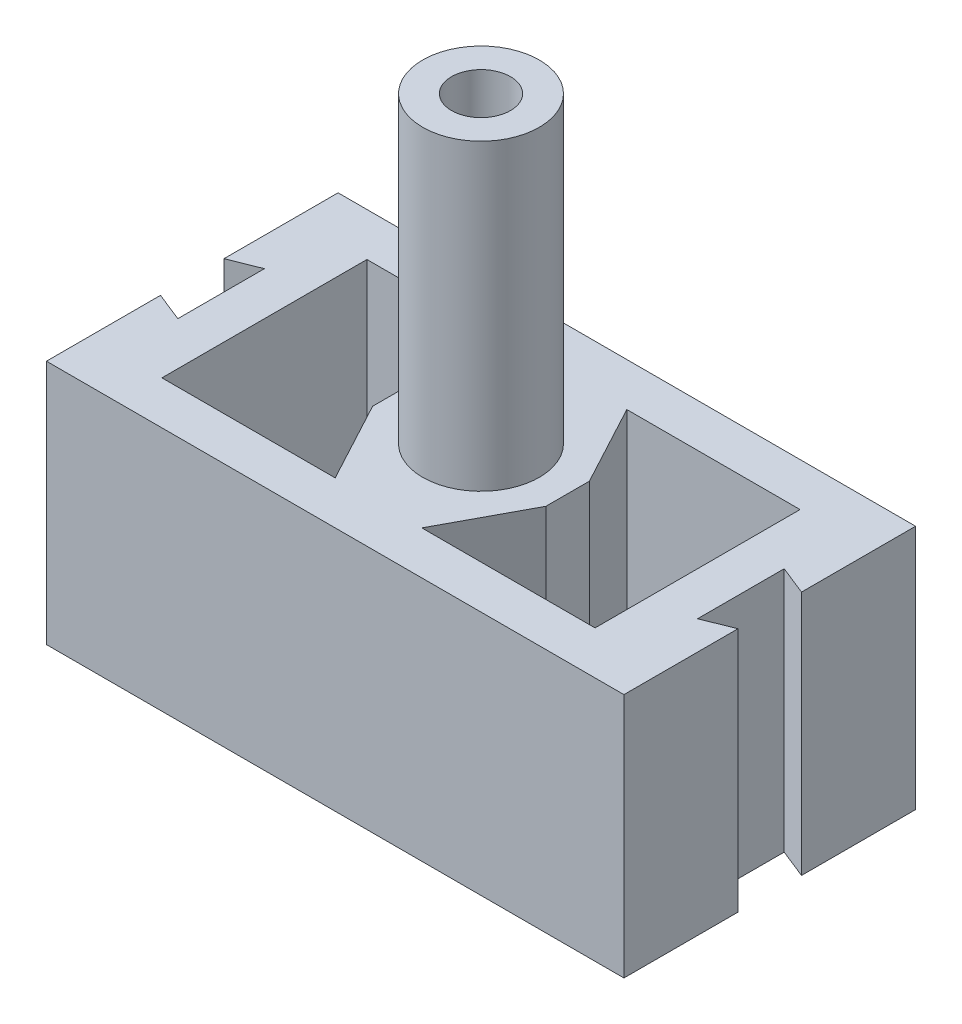
ISO-10303-21;
HEADER;
FILE_DESCRIPTION(('STEP AP214'),'2;1');
FILE_NAME('part.step','',(''),(''),'','','');
FILE_SCHEMA(('AUTOMOTIVE_DESIGN { 1 0 10303 214 1 1 1 1 }'));
ENDSEC;
DATA;
#1=APPLICATION_CONTEXT('core data for automotive mechanical design processes');
#2=APPLICATION_PROTOCOL_DEFINITION('international standard','automotive_design',2000,#1);
#3=PRODUCT_CONTEXT('',#1,'mechanical');
#4=PRODUCT('Part','Part','',(#3));
#5=PRODUCT_RELATED_PRODUCT_CATEGORY('part','',(#4));
#6=PRODUCT_DEFINITION_FORMATION('','',#4);
#7=PRODUCT_DEFINITION_CONTEXT('part definition',#1,'design');
#8=PRODUCT_DEFINITION('design','',#6,#7);
#9=PRODUCT_DEFINITION_SHAPE('','',#8);
#10=(LENGTH_UNIT() NAMED_UNIT(*) SI_UNIT(.MILLI.,.METRE.));
#11=(NAMED_UNIT(*) PLANE_ANGLE_UNIT() SI_UNIT($,.RADIAN.));
#12=(NAMED_UNIT(*) SI_UNIT($,.STERADIAN.) SOLID_ANGLE_UNIT());
#13=UNCERTAINTY_MEASURE_WITH_UNIT(LENGTH_MEASURE(1.E-05),#10,'distance_accuracy_value','');
#14=(GEOMETRIC_REPRESENTATION_CONTEXT(3) GLOBAL_UNCERTAINTY_ASSIGNED_CONTEXT((#13)) GLOBAL_UNIT_ASSIGNED_CONTEXT((#10,
#11,#12)) REPRESENTATION_CONTEXT('',''));
#15=CARTESIAN_POINT('',(0.,0.,0.));
#16=DIRECTION('',(0.,0.,1.));
#17=DIRECTION('',(1.,0.,0.));
#18=AXIS2_PLACEMENT_3D('',#15,#16,#17);
#19=CARTESIAN_POINT('',(0.,42.5,0.));
#20=DIRECTION('',(0.,1.,0.));
#21=DIRECTION('',(0.,0.,1.));
#22=AXIS2_PLACEMENT_3D('',#19,#20,#21);
#23=PLANE('',#22);
#24=CARTESIAN_POINT('',(0.,42.5,0.));
#25=DIRECTION('',(0.,1.,0.));
#26=DIRECTION('',(0.,0.,1.));
#27=AXIS2_PLACEMENT_3D('',#24,#25,#26);
#28=CIRCLE('',#27,3.1);
#29=CARTESIAN_POINT('',(0.,42.5,3.1));
#30=VERTEX_POINT('',#29);
#31=EDGE_CURVE('E299',#30,#30,#28,.T.);
#32=ORIENTED_EDGE('',*,*,#31,.F.);
#33=EDGE_LOOP('',(#32));
#34=FACE_BOUND('',#33,.T.);
#35=CARTESIAN_POINT('',(0.,42.5,0.));
#36=DIRECTION('',(0.,1.,0.));
#37=DIRECTION('',(0.,0.,1.));
#38=AXIS2_PLACEMENT_3D('',#35,#36,#37);
#39=CIRCLE('',#38,5.1);
#40=CARTESIAN_POINT('',(0.,42.5,5.1));
#41=VERTEX_POINT('',#40);
#42=EDGE_CURVE('E11',#41,#41,#39,.F.);
#43=ORIENTED_EDGE('',*,*,#42,.F.);
#44=EDGE_LOOP('',(#43));
#45=FACE_BOUND('',#44,.T.);
#46=ADVANCED_FACE('F40',(#34,#45),#23,.T.);
#47=CARTESIAN_POINT('',(8.79310344827583,42.5,21.9827586206896));
#48=DIRECTION('',(-0.371390676354103,0.,-0.92847669088526));
#49=DIRECTION('',(-0.92847669088526,0.,0.371390676354103));
#50=AXIS2_PLACEMENT_3D('',#47,#48,#49);
#51=PLANE('',#50);
#52=DIRECTION('',(0.92847669088526,0.,-0.371390676354103));
#53=VECTOR('',#52,1.);
#54=CARTESIAN_POINT('',(8.79310344827583,0.,21.9827586206896));
#55=LINE('',#54,#53);
#56=CARTESIAN_POINT('',(45.,0.,7.5));
#57=VERTEX_POINT('',#56);
#58=CARTESIAN_POINT('',(50.,0.,5.49999999999999));
#59=VERTEX_POINT('',#58);
#60=EDGE_CURVE('E335',#57,#59,#55,.T.);
#61=ORIENTED_EDGE('',*,*,#60,.F.);
#62=DIRECTION('',(0.,-1.,0.));
#63=VECTOR('',#62,1.);
#64=CARTESIAN_POINT('',(45.,42.5,7.5));
#65=LINE('',#64,#63);
#66=CARTESIAN_POINT('',(45.,42.5,7.5));
#67=VERTEX_POINT('',#66);
#68=EDGE_CURVE('E48',#67,#57,#65,.T.);
#69=ORIENTED_EDGE('',*,*,#68,.F.);
#70=DIRECTION('',(0.92847669088526,0.,-0.371390676354103));
#71=VECTOR('',#70,1.);
#72=CARTESIAN_POINT('',(8.79310344827583,42.5,21.9827586206896));
#73=LINE('',#72,#71);
#74=CARTESIAN_POINT('',(50.,42.5,5.49999999999999));
#75=VERTEX_POINT('',#74);
#76=EDGE_CURVE('E302',#67,#75,#73,.T.);
#77=ORIENTED_EDGE('',*,*,#76,.T.);
#78=DIRECTION('',(0.,-1.,0.));
#79=VECTOR('',#78,1.);
#80=CARTESIAN_POINT('',(50.,42.5,5.49999999999999));
#81=LINE('',#80,#79);
#82=EDGE_CURVE('E366',#75,#59,#81,.T.);
#83=ORIENTED_EDGE('',*,*,#82,.T.);
#84=EDGE_LOOP('',(#61,#69,#77,#83));
#85=FACE_BOUND('',#84,.T.);
#86=ADVANCED_FACE('F397',(#85),#51,.T.);
#87=CARTESIAN_POINT('',(45.,42.5,0.));
#88=DIRECTION('',(1.,0.,0.));
#89=DIRECTION('',(0.,0.,-1.));
#90=AXIS2_PLACEMENT_3D('',#87,#88,#89);
#91=PLANE('',#90);
#92=DIRECTION('',(0.,0.,1.));
#93=VECTOR('',#92,1.);
#94=CARTESIAN_POINT('',(45.,0.,0.));
#95=LINE('',#94,#93);
#96=CARTESIAN_POINT('',(45.,0.,-7.49999999999999));
#97=VERTEX_POINT('',#96);
#98=EDGE_CURVE('E338',#97,#57,#95,.T.);
#99=ORIENTED_EDGE('',*,*,#98,.F.);
#100=DIRECTION('',(0.,-1.,0.));
#101=VECTOR('',#100,1.);
#102=CARTESIAN_POINT('',(45.,42.5,-7.49999999999999));
#103=LINE('',#102,#101);
#104=CARTESIAN_POINT('',(45.,42.5,-7.49999999999999));
#105=VERTEX_POINT('',#104);
#106=EDGE_CURVE('E389',#105,#97,#103,.T.);
#107=ORIENTED_EDGE('',*,*,#106,.F.);
#108=DIRECTION('',(0.,0.,1.));
#109=VECTOR('',#108,1.);
#110=CARTESIAN_POINT('',(45.,42.5,0.));
#111=LINE('',#110,#109);
#112=EDGE_CURVE('E306',#105,#67,#111,.T.);
#113=ORIENTED_EDGE('',*,*,#112,.T.);
#114=ORIENTED_EDGE('',*,*,#68,.T.);
#115=EDGE_LOOP('',(#99,#107,#113,#114));
#116=FACE_BOUND('',#115,.T.);
#117=ADVANCED_FACE('F393',(#116),#91,.T.);
#118=CARTESIAN_POINT('',(8.79310344827585,42.5,-21.9827586206896));
#119=DIRECTION('',(-0.371390676354103,0.,0.928476690885259));
#120=DIRECTION('',(0.92847669088526,0.,0.371390676354103));
#121=AXIS2_PLACEMENT_3D('',#118,#119,#120);
#122=PLANE('',#121);
#123=DIRECTION('',(-0.92847669088526,0.,-0.371390676354103));
#124=VECTOR('',#123,1.);
#125=CARTESIAN_POINT('',(8.79310344827585,0.,-21.9827586206896));
#126=LINE('',#125,#124);
#127=CARTESIAN_POINT('',(50.,0.,-5.49999999999998));
#128=VERTEX_POINT('',#127);
#129=EDGE_CURVE('E341',#128,#97,#126,.T.);
#130=ORIENTED_EDGE('',*,*,#129,.F.);
#131=DIRECTION('',(0.,-1.,0.));
#132=VECTOR('',#131,1.);
#133=CARTESIAN_POINT('',(50.,42.5,-5.49999999999998));
#134=LINE('',#133,#132);
#135=CARTESIAN_POINT('',(50.,42.5,-5.49999999999998));
#136=VERTEX_POINT('',#135);
#137=EDGE_CURVE('E387',#136,#128,#134,.T.);
#138=ORIENTED_EDGE('',*,*,#137,.F.);
#139=DIRECTION('',(-0.92847669088526,0.,-0.371390676354103));
#140=VECTOR('',#139,1.);
#141=CARTESIAN_POINT('',(8.79310344827585,42.5,-21.9827586206896));
#142=LINE('',#141,#140);
#143=EDGE_CURVE('E309',#136,#105,#142,.T.);
#144=ORIENTED_EDGE('',*,*,#143,.T.);
#145=ORIENTED_EDGE('',*,*,#106,.T.);
#146=EDGE_LOOP('',(#130,#138,#144,#145));
#147=FACE_BOUND('',#146,.T.);
#148=ADVANCED_FACE('F405',(#147),#122,.T.);
#149=CARTESIAN_POINT('',(50.,42.5,0.));
#150=DIRECTION('',(-1.,0.,0.));
#151=DIRECTION('',(0.,0.,1.));
#152=AXIS2_PLACEMENT_3D('',#149,#150,#151);
#153=PLANE('',#152);
#154=DIRECTION('',(0.,0.,-1.));
#155=VECTOR('',#154,1.);
#156=CARTESIAN_POINT('',(50.,0.,0.));
#157=LINE('',#156,#155);
#158=CARTESIAN_POINT('',(50.,0.,-25.25));
#159=VERTEX_POINT('',#158);
#160=EDGE_CURVE('E344',#128,#159,#157,.T.);
#161=ORIENTED_EDGE('',*,*,#160,.T.);
#162=DIRECTION('',(0.,-1.,0.));
#163=VECTOR('',#162,1.);
#164=CARTESIAN_POINT('',(50.,42.5,-25.25));
#165=LINE('',#164,#163);
#166=CARTESIAN_POINT('',(50.,42.5,-25.25));
#167=VERTEX_POINT('',#166);
#168=EDGE_CURVE('E385',#167,#159,#165,.T.);
#169=ORIENTED_EDGE('',*,*,#168,.F.);
#170=DIRECTION('',(0.,0.,-1.));
#171=VECTOR('',#170,1.);
#172=CARTESIAN_POINT('',(50.,42.5,0.));
#173=LINE('',#172,#171);
#174=EDGE_CURVE('E312',#136,#167,#173,.T.);
#175=ORIENTED_EDGE('',*,*,#174,.F.);
#176=ORIENTED_EDGE('',*,*,#137,.T.);
#177=EDGE_LOOP('',(#161,#169,#175,#176));
#178=FACE_BOUND('',#177,.T.);
#179=ADVANCED_FACE('F442',(#178),#153,.F.);
#180=CARTESIAN_POINT('',(0.,42.5,-25.25));
#181=DIRECTION('',(0.,0.,-1.));
#182=DIRECTION('',(-1.,0.,0.));
#183=AXIS2_PLACEMENT_3D('',#180,#181,#182);
#184=PLANE('',#183);
#185=DIRECTION('',(1.,0.,0.));
#186=VECTOR('',#185,1.);
#187=CARTESIAN_POINT('',(0.,0.,-25.25));
#188=LINE('',#187,#186);
#189=CARTESIAN_POINT('',(-50.,0.,-25.25));
#190=VERTEX_POINT('',#189);
#191=EDGE_CURVE('E347',#190,#159,#188,.T.);
#192=ORIENTED_EDGE('',*,*,#191,.F.);
#193=DIRECTION('',(0.,-1.,0.));
#194=VECTOR('',#193,1.);
#195=CARTESIAN_POINT('',(-50.,42.5,-25.25));
#196=LINE('',#195,#194);
#197=CARTESIAN_POINT('',(-50.,42.5,-25.25));
#198=VERTEX_POINT('',#197);
#199=EDGE_CURVE('E383',#198,#190,#196,.T.);
#200=ORIENTED_EDGE('',*,*,#199,.F.);
#201=DIRECTION('',(1.,0.,0.));
#202=VECTOR('',#201,1.);
#203=CARTESIAN_POINT('',(0.,42.5,-25.25));
#204=LINE('',#203,#202);
#205=EDGE_CURVE('E314',#198,#167,#204,.T.);
#206=ORIENTED_EDGE('',*,*,#205,.T.);
#207=ORIENTED_EDGE('',*,*,#168,.T.);
#208=EDGE_LOOP('',(#192,#200,#206,#207));
#209=FACE_BOUND('',#208,.T.);
#210=ADVANCED_FACE('F438',(#209),#184,.T.);
#211=CARTESIAN_POINT('',(-50.,42.5,0.));
#212=DIRECTION('',(-1.,0.,0.));
#213=DIRECTION('',(0.,0.,1.));
#214=AXIS2_PLACEMENT_3D('',#211,#212,#213);
#215=PLANE('',#214);
#216=DIRECTION('',(0.,0.,-1.));
#217=VECTOR('',#216,1.);
#218=CARTESIAN_POINT('',(-50.,0.,0.));
#219=LINE('',#218,#217);
#220=CARTESIAN_POINT('',(-50.,0.,-5.49999999999999));
#221=VERTEX_POINT('',#220);
#222=EDGE_CURVE('E350',#221,#190,#219,.T.);
#223=ORIENTED_EDGE('',*,*,#222,.F.);
#224=DIRECTION('',(0.,-1.,0.));
#225=VECTOR('',#224,1.);
#226=CARTESIAN_POINT('',(-50.,42.5,-5.49999999999999));
#227=LINE('',#226,#225);
#228=CARTESIAN_POINT('',(-50.,42.5,-5.49999999999999));
#229=VERTEX_POINT('',#228);
#230=EDGE_CURVE('E381',#229,#221,#227,.T.);
#231=ORIENTED_EDGE('',*,*,#230,.F.);
#232=DIRECTION('',(0.,0.,-1.));
#233=VECTOR('',#232,1.);
#234=CARTESIAN_POINT('',(-50.,42.5,0.));
#235=LINE('',#234,#233);
#236=EDGE_CURVE('E318',#229,#198,#235,.T.);
#237=ORIENTED_EDGE('',*,*,#236,.T.);
#238=ORIENTED_EDGE('',*,*,#199,.T.);
#239=EDGE_LOOP('',(#223,#231,#237,#238));
#240=FACE_BOUND('',#239,.T.);
#241=ADVANCED_FACE('F435',(#240),#215,.T.);
#242=CARTESIAN_POINT('',(-8.79310344827585,42.5,-21.9827586206896));
#243=DIRECTION('',(-0.371390676354103,0.,-0.928476690885259));
#244=DIRECTION('',(-0.92847669088526,0.,0.371390676354103));
#245=AXIS2_PLACEMENT_3D('',#242,#243,#244);
#246=PLANE('',#245);
#247=DIRECTION('',(0.92847669088526,0.,-0.371390676354103));
#248=VECTOR('',#247,1.);
#249=CARTESIAN_POINT('',(-8.79310344827585,0.,-21.9827586206896));
#250=LINE('',#249,#248);
#251=CARTESIAN_POINT('',(-45.,0.,-7.5));
#252=VERTEX_POINT('',#251);
#253=EDGE_CURVE('E353',#221,#252,#250,.T.);
#254=ORIENTED_EDGE('',*,*,#253,.T.);
#255=DIRECTION('',(0.,-1.,0.));
#256=VECTOR('',#255,1.);
#257=CARTESIAN_POINT('',(-45.,42.5,-7.5));
#258=LINE('',#257,#256);
#259=CARTESIAN_POINT('',(-45.,42.5,-7.5));
#260=VERTEX_POINT('',#259);
#261=EDGE_CURVE('E378',#260,#252,#258,.T.);
#262=ORIENTED_EDGE('',*,*,#261,.F.);
#263=DIRECTION('',(0.92847669088526,0.,-0.371390676354103));
#264=VECTOR('',#263,1.);
#265=CARTESIAN_POINT('',(-8.79310344827585,42.5,-21.9827586206896));
#266=LINE('',#265,#264);
#267=EDGE_CURVE('E321',#229,#260,#266,.T.);
#268=ORIENTED_EDGE('',*,*,#267,.F.);
#269=ORIENTED_EDGE('',*,*,#230,.T.);
#270=EDGE_LOOP('',(#254,#262,#268,#269));
#271=FACE_BOUND('',#270,.T.);
#272=ADVANCED_FACE('F432',(#271),#246,.F.);
#273=CARTESIAN_POINT('',(-45.,42.5,0.));
#274=DIRECTION('',(1.,0.,0.));
#275=DIRECTION('',(0.,0.,-1.));
#276=AXIS2_PLACEMENT_3D('',#273,#274,#275);
#277=PLANE('',#276);
#278=DIRECTION('',(0.,0.,1.));
#279=VECTOR('',#278,1.);
#280=CARTESIAN_POINT('',(-45.,0.,0.));
#281=LINE('',#280,#279);
#282=CARTESIAN_POINT('',(-45.,0.,7.5));
#283=VERTEX_POINT('',#282);
#284=EDGE_CURVE('E357',#252,#283,#281,.T.);
#285=ORIENTED_EDGE('',*,*,#284,.T.);
#286=DIRECTION('',(0.,-1.,0.));
#287=VECTOR('',#286,1.);
#288=CARTESIAN_POINT('',(-45.,42.5,7.5));
#289=LINE('',#288,#287);
#290=CARTESIAN_POINT('',(-45.,42.5,7.5));
#291=VERTEX_POINT('',#290);
#292=EDGE_CURVE('E375',#291,#283,#289,.T.);
#293=ORIENTED_EDGE('',*,*,#292,.F.);
#294=DIRECTION('',(0.,0.,1.));
#295=VECTOR('',#294,1.);
#296=CARTESIAN_POINT('',(-45.,42.5,0.));
#297=LINE('',#296,#295);
#298=EDGE_CURVE('E325',#260,#291,#297,.T.);
#299=ORIENTED_EDGE('',*,*,#298,.F.);
#300=ORIENTED_EDGE('',*,*,#261,.T.);
#301=EDGE_LOOP('',(#285,#293,#299,#300));
#302=FACE_BOUND('',#301,.T.);
#303=ADVANCED_FACE('F429',(#302),#277,.F.);
#304=CARTESIAN_POINT('',(-8.79310344827583,42.5,21.9827586206896));
#305=DIRECTION('',(-0.371390676354103,0.,0.92847669088526));
#306=DIRECTION('',(0.92847669088526,0.,0.371390676354103));
#307=AXIS2_PLACEMENT_3D('',#304,#305,#306);
#308=PLANE('',#307);
#309=DIRECTION('',(-0.92847669088526,0.,-0.371390676354103));
#310=VECTOR('',#309,1.);
#311=CARTESIAN_POINT('',(-8.79310344827583,0.,21.9827586206896));
#312=LINE('',#311,#310);
#313=CARTESIAN_POINT('',(-50.,0.,5.49999999999999));
#314=VERTEX_POINT('',#313);
#315=EDGE_CURVE('E360',#283,#314,#312,.T.);
#316=ORIENTED_EDGE('',*,*,#315,.T.);
#317=DIRECTION('',(0.,-1.,0.));
#318=VECTOR('',#317,1.);
#319=CARTESIAN_POINT('',(-50.,42.5,5.49999999999999));
#320=LINE('',#319,#318);
#321=CARTESIAN_POINT('',(-50.,42.5,5.49999999999999));
#322=VERTEX_POINT('',#321);
#323=EDGE_CURVE('E373',#322,#314,#320,.T.);
#324=ORIENTED_EDGE('',*,*,#323,.F.);
#325=DIRECTION('',(-0.92847669088526,0.,-0.371390676354103));
#326=VECTOR('',#325,1.);
#327=CARTESIAN_POINT('',(-8.79310344827583,42.5,21.9827586206896));
#328=LINE('',#327,#326);
#329=EDGE_CURVE('E328',#291,#322,#328,.T.);
#330=ORIENTED_EDGE('',*,*,#329,.F.);
#331=ORIENTED_EDGE('',*,*,#292,.T.);
#332=EDGE_LOOP('',(#316,#324,#330,#331));
#333=FACE_BOUND('',#332,.T.);
#334=ADVANCED_FACE('F423',(#333),#308,.F.);
#335=CARTESIAN_POINT('',(-50.,0.,25.25));
#336=VERTEX_POINT('',#335);
#337=EDGE_CURVE('E354',#336,#314,#219,.T.);
#338=ORIENTED_EDGE('',*,*,#337,.F.);
#339=DIRECTION('',(0.,-1.,0.));
#340=VECTOR('',#339,1.);
#341=CARTESIAN_POINT('',(-50.,42.5,25.25));
#342=LINE('',#341,#340);
#343=CARTESIAN_POINT('',(-50.,42.5,25.25));
#344=VERTEX_POINT('',#343);
#345=EDGE_CURVE('E371',#344,#336,#342,.T.);
#346=ORIENTED_EDGE('',*,*,#345,.F.);
#347=EDGE_CURVE('E322',#344,#322,#235,.T.);
#348=ORIENTED_EDGE('',*,*,#347,.T.);
#349=ORIENTED_EDGE('',*,*,#323,.T.);
#350=EDGE_LOOP('',(#338,#346,#348,#349));
#351=FACE_BOUND('',#350,.T.);
#352=ADVANCED_FACE('F419',(#351),#215,.T.);
#353=CARTESIAN_POINT('',(0.,42.5,25.25));
#354=DIRECTION('',(0.,0.,-1.));
#355=DIRECTION('',(-1.,0.,0.));
#356=AXIS2_PLACEMENT_3D('',#353,#354,#355);
#357=PLANE('',#356);
#358=DIRECTION('',(1.,0.,0.));
#359=VECTOR('',#358,1.);
#360=CARTESIAN_POINT('',(0.,0.,25.25));
#361=LINE('',#360,#359);
#362=CARTESIAN_POINT('',(50.,0.,25.25));
#363=VERTEX_POINT('',#362);
#364=EDGE_CURVE('E363',#336,#363,#361,.T.);
#365=ORIENTED_EDGE('',*,*,#364,.T.);
#366=DIRECTION('',(0.,-1.,0.));
#367=VECTOR('',#366,1.);
#368=CARTESIAN_POINT('',(50.,42.5,25.25));
#369=LINE('',#368,#367);
#370=CARTESIAN_POINT('',(50.,42.5,25.25));
#371=VERTEX_POINT('',#370);
#372=EDGE_CURVE('E368',#371,#363,#369,.T.);
#373=ORIENTED_EDGE('',*,*,#372,.F.);
#374=DIRECTION('',(1.,0.,0.));
#375=VECTOR('',#374,1.);
#376=CARTESIAN_POINT('',(0.,42.5,25.25));
#377=LINE('',#376,#375);
#378=EDGE_CURVE('E330',#344,#371,#377,.T.);
#379=ORIENTED_EDGE('',*,*,#378,.F.);
#380=ORIENTED_EDGE('',*,*,#345,.T.);
#381=EDGE_LOOP('',(#365,#373,#379,#380));
#382=FACE_BOUND('',#381,.T.);
#383=ADVANCED_FACE('F489',(#382),#357,.F.);
#384=CARTESIAN_POINT('',(0.,42.5,0.));
#385=DIRECTION('',(0.,-1.,0.));
#386=DIRECTION('',(0.,0.,-1.));
#387=AXIS2_PLACEMENT_3D('',#384,#385,#386);
#388=CYLINDRICAL_SURFACE('',#387,3.1);
#389=ORIENTED_EDGE('',*,*,#31,.T.);
#390=EDGE_LOOP('',(#389));
#391=FACE_BOUND('',#390,.T.);
#392=CARTESIAN_POINT('',(0.,0.,0.));
#393=DIRECTION('',(0.,1.,0.));
#394=DIRECTION('',(0.,0.,1.));
#395=AXIS2_PLACEMENT_3D('',#392,#393,#394);
#396=CIRCLE('',#395,3.1);
#397=CARTESIAN_POINT('',(0.,0.,3.1));
#398=VERTEX_POINT('',#397);
#399=EDGE_CURVE('E296',#398,#398,#396,.T.);
#400=ORIENTED_EDGE('',*,*,#399,.F.);
#401=EDGE_LOOP('',(#400));
#402=FACE_BOUND('',#401,.T.);
#403=ADVANCED_FACE('F42',(#391,#402),#388,.F.);
#404=EDGE_CURVE('E303',#363,#59,#157,.T.);
#405=ORIENTED_EDGE('',*,*,#404,.T.);
#406=ORIENTED_EDGE('',*,*,#82,.F.);
#407=EDGE_CURVE('E315',#371,#75,#173,.T.);
#408=ORIENTED_EDGE('',*,*,#407,.F.);
#409=ORIENTED_EDGE('',*,*,#372,.T.);
#410=EDGE_LOOP('',(#405,#406,#408,#409));
#411=FACE_BOUND('',#410,.T.);
#412=ADVANCED_FACE('F413',(#411),#153,.F.);
#413=DIRECTION('',(1.,0.,0.));
#414=VECTOR('',#413,1.);
#415=CARTESIAN_POINT('',(-7.5,42.5,17.75));
#416=LINE('',#415,#414);
#417=CARTESIAN_POINT('',(-37.5,42.5,17.75));
#418=VERTEX_POINT('',#417);
#419=CARTESIAN_POINT('',(-7.5,42.5,17.75));
#420=VERTEX_POINT('',#419);
#421=EDGE_CURVE('E55',#418,#420,#416,.T.);
#422=ORIENTED_EDGE('',*,*,#421,.F.);
#423=DIRECTION('',(0.,0.,1.));
#424=VECTOR('',#423,1.);
#425=CARTESIAN_POINT('',(-37.5,42.5,17.75));
#426=LINE('',#425,#424);
#427=CARTESIAN_POINT('',(-37.5,42.5,-17.75));
#428=VERTEX_POINT('',#427);
#429=EDGE_CURVE('E234',#428,#418,#426,.T.);
#430=ORIENTED_EDGE('',*,*,#429,.F.);
#431=DIRECTION('',(-1.,0.,0.));
#432=VECTOR('',#431,1.);
#433=CARTESIAN_POINT('',(-37.5,42.5,-17.75));
#434=LINE('',#433,#432);
#435=CARTESIAN_POINT('',(-7.5,42.5,-17.75));
#436=VERTEX_POINT('',#435);
#437=EDGE_CURVE('E228',#436,#428,#434,.T.);
#438=ORIENTED_EDGE('',*,*,#437,.F.);
#439=DIRECTION('',(0.472729094696456,0.,-0.881207809218387));
#440=VECTOR('',#439,1.);
#441=CARTESIAN_POINT('',(-7.5,42.5,-17.75));
#442=LINE('',#441,#440);
#443=CARTESIAN_POINT('',(-15.,42.5,-3.76935306439804));
#444=VERTEX_POINT('',#443);
#445=EDGE_CURVE('E226',#444,#436,#442,.T.);
#446=ORIENTED_EDGE('',*,*,#445,.F.);
#447=DIRECTION('',(0.,0.,-1.));
#448=VECTOR('',#447,1.);
#449=CARTESIAN_POINT('',(-15.,42.5,-3.76935306439804));
#450=LINE('',#449,#448);
#451=CARTESIAN_POINT('',(-15.,42.5,3.76935306439803));
#452=VERTEX_POINT('',#451);
#453=EDGE_CURVE('E208',#452,#444,#450,.T.);
#454=ORIENTED_EDGE('',*,*,#453,.F.);
#455=DIRECTION('',(-0.472729094696456,0.,-0.881207809218387));
#456=VECTOR('',#455,1.);
#457=CARTESIAN_POINT('',(-15.,42.5,3.76935306439803));
#458=LINE('',#457,#456);
#459=EDGE_CURVE('E218',#420,#452,#458,.T.);
#460=ORIENTED_EDGE('',*,*,#459,.F.);
#461=EDGE_LOOP('',(#422,#430,#438,#446,#454,#460));
#462=FACE_BOUND('',#461,.T.);
#463=DIRECTION('',(0.,0.,1.));
#464=VECTOR('',#463,1.);
#465=CARTESIAN_POINT('',(15.,42.5,-3.76935306439804));
#466=LINE('',#465,#464);
#467=CARTESIAN_POINT('',(15.,42.5,-3.76935306439804));
#468=VERTEX_POINT('',#467);
#469=CARTESIAN_POINT('',(15.,42.5,3.76935306439803));
#470=VERTEX_POINT('',#469);
#471=EDGE_CURVE('E63',#468,#470,#466,.T.);
#472=ORIENTED_EDGE('',*,*,#471,.F.);
#473=DIRECTION('',(0.472729094696456,0.,0.881207809218387));
#474=VECTOR('',#473,1.);
#475=CARTESIAN_POINT('',(7.5,42.5,-17.75));
#476=LINE('',#475,#474);
#477=CARTESIAN_POINT('',(7.5,42.5,-17.75));
#478=VERTEX_POINT('',#477);
#479=EDGE_CURVE('E254',#478,#468,#476,.T.);
#480=ORIENTED_EDGE('',*,*,#479,.F.);
#481=DIRECTION('',(-1.,0.,0.));
#482=VECTOR('',#481,1.);
#483=CARTESIAN_POINT('',(37.5,42.5,-17.75));
#484=LINE('',#483,#482);
#485=CARTESIAN_POINT('',(37.5,42.5,-17.75));
#486=VERTEX_POINT('',#485);
#487=EDGE_CURVE('E268',#486,#478,#484,.T.);
#488=ORIENTED_EDGE('',*,*,#487,.F.);
#489=DIRECTION('',(0.,0.,-1.));
#490=VECTOR('',#489,1.);
#491=CARTESIAN_POINT('',(37.5,42.5,17.75));
#492=LINE('',#491,#490);
#493=CARTESIAN_POINT('',(37.5,42.5,17.75));
#494=VERTEX_POINT('',#493);
#495=EDGE_CURVE('E271',#494,#486,#492,.T.);
#496=ORIENTED_EDGE('',*,*,#495,.F.);
#497=DIRECTION('',(1.,0.,0.));
#498=VECTOR('',#497,1.);
#499=CARTESIAN_POINT('',(7.50000000000001,42.5,17.75));
#500=LINE('',#499,#498);
#501=CARTESIAN_POINT('',(7.50000000000001,42.5,17.75));
#502=VERTEX_POINT('',#501);
#503=EDGE_CURVE('E274',#502,#494,#500,.T.);
#504=ORIENTED_EDGE('',*,*,#503,.F.);
#505=DIRECTION('',(-0.472729094696456,0.,0.881207809218387));
#506=VECTOR('',#505,1.);
#507=CARTESIAN_POINT('',(15.,42.5,3.76935306439803));
#508=LINE('',#507,#506);
#509=EDGE_CURVE('E277',#470,#502,#508,.T.);
#510=ORIENTED_EDGE('',*,*,#509,.F.);
#511=EDGE_LOOP('',(#472,#480,#488,#496,#504,#510));
#512=FACE_BOUND('',#511,.T.);
#513=CARTESIAN_POINT('',(0.,42.5,0.));
#514=DIRECTION('',(0.,1.,0.));
#515=DIRECTION('',(0.,0.,1.));
#516=AXIS2_PLACEMENT_3D('',#513,#514,#515);
#517=CIRCLE('',#516,10.1);
#518=CARTESIAN_POINT('',(0.,42.5,10.1));
#519=VERTEX_POINT('',#518);
#520=EDGE_CURVE('E292',#519,#519,#517,.T.);
#521=ORIENTED_EDGE('',*,*,#520,.F.);
#522=EDGE_LOOP('',(#521));
#523=FACE_BOUND('',#522,.T.);
#524=ORIENTED_EDGE('',*,*,#76,.F.);
#525=ORIENTED_EDGE('',*,*,#112,.F.);
#526=ORIENTED_EDGE('',*,*,#143,.F.);
#527=ORIENTED_EDGE('',*,*,#174,.T.);
#528=ORIENTED_EDGE('',*,*,#205,.F.);
#529=ORIENTED_EDGE('',*,*,#236,.F.);
#530=ORIENTED_EDGE('',*,*,#267,.T.);
#531=ORIENTED_EDGE('',*,*,#298,.T.);
#532=ORIENTED_EDGE('',*,*,#329,.T.);
#533=ORIENTED_EDGE('',*,*,#347,.F.);
#534=ORIENTED_EDGE('',*,*,#378,.T.);
#535=ORIENTED_EDGE('',*,*,#407,.T.);
#536=EDGE_LOOP('',(#524,#525,#526,#527,#528,#529,#530,#531,#532,#533,#534,#535));
#537=FACE_BOUND('',#536,.T.);
#538=ADVANCED_FACE('F222',(#462,#512,#523,#537),#23,.T.);
#539=CARTESIAN_POINT('',(0.,0.,0.));
#540=DIRECTION('',(0.,1.,0.));
#541=DIRECTION('',(0.,0.,1.));
#542=AXIS2_PLACEMENT_3D('',#539,#540,#541);
#543=PLANE('',#542);
#544=DIRECTION('',(0.,0.,-1.));
#545=VECTOR('',#544,1.);
#546=CARTESIAN_POINT('',(-37.5,0.,17.75));
#547=LINE('',#546,#545);
#548=CARTESIAN_POINT('',(-37.5,0.,17.75));
#549=VERTEX_POINT('',#548);
#550=CARTESIAN_POINT('',(-37.5,0.,-17.75));
#551=VERTEX_POINT('',#550);
#552=EDGE_CURVE('E481',#549,#551,#547,.T.);
#553=ORIENTED_EDGE('',*,*,#552,.F.);
#554=DIRECTION('',(-1.,0.,0.));
#555=VECTOR('',#554,1.);
#556=CARTESIAN_POINT('',(-7.5,0.,17.75));
#557=LINE('',#556,#555);
#558=CARTESIAN_POINT('',(-7.5,0.,17.75));
#559=VERTEX_POINT('',#558);
#560=EDGE_CURVE('E248',#559,#549,#557,.T.);
#561=ORIENTED_EDGE('',*,*,#560,.F.);
#562=DIRECTION('',(0.472729094696456,0.,0.881207809218387));
#563=VECTOR('',#562,1.);
#564=CARTESIAN_POINT('',(-15.,0.,3.76935306439803));
#565=LINE('',#564,#563);
#566=CARTESIAN_POINT('',(-15.,0.,3.76935306439803));
#567=VERTEX_POINT('',#566);
#568=EDGE_CURVE('E245',#567,#559,#565,.T.);
#569=ORIENTED_EDGE('',*,*,#568,.F.);
#570=DIRECTION('',(0.,0.,1.));
#571=VECTOR('',#570,1.);
#572=CARTESIAN_POINT('',(-15.,0.,-3.76935306439804));
#573=LINE('',#572,#571);
#574=CARTESIAN_POINT('',(-15.,0.,-3.76935306439804));
#575=VERTEX_POINT('',#574);
#576=EDGE_CURVE('E211',#575,#567,#573,.T.);
#577=ORIENTED_EDGE('',*,*,#576,.F.);
#578=DIRECTION('',(-0.472729094696456,0.,0.881207809218387));
#579=VECTOR('',#578,1.);
#580=CARTESIAN_POINT('',(-7.5,0.,-17.75));
#581=LINE('',#580,#579);
#582=CARTESIAN_POINT('',(-7.5,0.,-17.75));
#583=VERTEX_POINT('',#582);
#584=EDGE_CURVE('E724',#583,#575,#581,.T.);
#585=ORIENTED_EDGE('',*,*,#584,.F.);
#586=DIRECTION('',(1.,0.,0.));
#587=VECTOR('',#586,1.);
#588=CARTESIAN_POINT('',(-37.5,0.,-17.75));
#589=LINE('',#588,#587);
#590=EDGE_CURVE('E725',#551,#583,#589,.T.);
#591=ORIENTED_EDGE('',*,*,#590,.F.);
#592=EDGE_LOOP('',(#553,#561,#569,#577,#585,#591));
#593=FACE_BOUND('',#592,.T.);
#594=DIRECTION('',(-0.472729094696456,0.,-0.881207809218387));
#595=VECTOR('',#594,1.);
#596=CARTESIAN_POINT('',(7.5,0.,-17.75));
#597=LINE('',#596,#595);
#598=CARTESIAN_POINT('',(15.,0.,-3.76935306439804));
#599=VERTEX_POINT('',#598);
#600=CARTESIAN_POINT('',(7.5,0.,-17.75));
#601=VERTEX_POINT('',#600);
#602=EDGE_CURVE('E282',#599,#601,#597,.T.);
#603=ORIENTED_EDGE('',*,*,#602,.F.);
#604=DIRECTION('',(0.,0.,-1.));
#605=VECTOR('',#604,1.);
#606=CARTESIAN_POINT('',(15.,0.,-3.76935306439804));
#607=LINE('',#606,#605);
#608=CARTESIAN_POINT('',(15.,0.,3.76935306439803));
#609=VERTEX_POINT('',#608);
#610=EDGE_CURVE('E251',#609,#599,#607,.T.);
#611=ORIENTED_EDGE('',*,*,#610,.F.);
#612=DIRECTION('',(0.472729094696456,0.,-0.881207809218387));
#613=VECTOR('',#612,1.);
#614=CARTESIAN_POINT('',(15.,0.,3.76935306439803));
#615=LINE('',#614,#613);
#616=CARTESIAN_POINT('',(7.50000000000001,0.,17.75));
#617=VERTEX_POINT('',#616);
#618=EDGE_CURVE('E249',#617,#609,#615,.T.);
#619=ORIENTED_EDGE('',*,*,#618,.F.);
#620=DIRECTION('',(-1.,0.,0.));
#621=VECTOR('',#620,1.);
#622=CARTESIAN_POINT('',(7.50000000000001,0.,17.75));
#623=LINE('',#622,#621);
#624=CARTESIAN_POINT('',(37.5,0.,17.75));
#625=VERTEX_POINT('',#624);
#626=EDGE_CURVE('E265',#625,#617,#623,.T.);
#627=ORIENTED_EDGE('',*,*,#626,.F.);
#628=DIRECTION('',(0.,0.,1.));
#629=VECTOR('',#628,1.);
#630=CARTESIAN_POINT('',(37.5,0.,17.75));
#631=LINE('',#630,#629);
#632=CARTESIAN_POINT('',(37.5,0.,-17.75));
#633=VERTEX_POINT('',#632);
#634=EDGE_CURVE('E286',#633,#625,#631,.T.);
#635=ORIENTED_EDGE('',*,*,#634,.F.);
#636=DIRECTION('',(1.,0.,0.));
#637=VECTOR('',#636,1.);
#638=CARTESIAN_POINT('',(37.5,0.,-17.75));
#639=LINE('',#638,#637);
#640=EDGE_CURVE('E284',#601,#633,#639,.T.);
#641=ORIENTED_EDGE('',*,*,#640,.F.);
#642=EDGE_LOOP('',(#603,#611,#619,#627,#635,#641));
#643=FACE_BOUND('',#642,.T.);
#644=ORIENTED_EDGE('',*,*,#399,.T.);
#645=EDGE_LOOP('',(#644));
#646=FACE_BOUND('',#645,.T.);
#647=ORIENTED_EDGE('',*,*,#60,.T.);
#648=ORIENTED_EDGE('',*,*,#404,.F.);
#649=ORIENTED_EDGE('',*,*,#364,.F.);
#650=ORIENTED_EDGE('',*,*,#337,.T.);
#651=ORIENTED_EDGE('',*,*,#315,.F.);
#652=ORIENTED_EDGE('',*,*,#284,.F.);
#653=ORIENTED_EDGE('',*,*,#253,.F.);
#654=ORIENTED_EDGE('',*,*,#222,.T.);
#655=ORIENTED_EDGE('',*,*,#191,.T.);
#656=ORIENTED_EDGE('',*,*,#160,.F.);
#657=ORIENTED_EDGE('',*,*,#129,.T.);
#658=ORIENTED_EDGE('',*,*,#98,.T.);
#659=EDGE_LOOP('',(#647,#648,#649,#650,#651,#652,#653,#654,#655,#656,#657,#658));
#660=FACE_BOUND('',#659,.T.);
#661=ADVANCED_FACE('F401',(#593,#643,#646,#660),#543,.F.);
#662=CARTESIAN_POINT('',(0.,95.,0.));
#663=DIRECTION('',(0.,1.,0.));
#664=DIRECTION('',(0.,0.,1.));
#665=AXIS2_PLACEMENT_3D('',#662,#663,#664);
#666=PLANE('',#665);
#667=CARTESIAN_POINT('',(0.,95.,0.));
#668=DIRECTION('',(0.,1.,0.));
#669=DIRECTION('',(0.,0.,1.));
#670=AXIS2_PLACEMENT_3D('',#667,#668,#669);
#671=CIRCLE('',#670,10.1);
#672=CARTESIAN_POINT('',(0.,95.,10.1));
#673=VERTEX_POINT('',#672);
#674=EDGE_CURVE('E293',#673,#673,#671,.T.);
#675=ORIENTED_EDGE('',*,*,#674,.T.);
#676=EDGE_LOOP('',(#675));
#677=FACE_BOUND('',#676,.T.);
#678=CARTESIAN_POINT('',(0.,95.,0.));
#679=DIRECTION('',(0.,1.,0.));
#680=DIRECTION('',(0.,0.,1.));
#681=AXIS2_PLACEMENT_3D('',#678,#679,#680);
#682=CIRCLE('',#681,5.1);
#683=CARTESIAN_POINT('',(0.,95.,5.1));
#684=VERTEX_POINT('',#683);
#685=EDGE_CURVE('E247',#684,#684,#682,.T.);
#686=ORIENTED_EDGE('',*,*,#685,.F.);
#687=EDGE_LOOP('',(#686));
#688=FACE_BOUND('',#687,.T.);
#689=ADVANCED_FACE('F469',(#677,#688),#666,.T.);
#690=CARTESIAN_POINT('',(0.,95.,0.));
#691=DIRECTION('',(0.,-1.,0.));
#692=DIRECTION('',(0.,0.,-1.));
#693=AXIS2_PLACEMENT_3D('',#690,#691,#692);
#694=CYLINDRICAL_SURFACE('',#693,10.1);
#695=ORIENTED_EDGE('',*,*,#674,.F.);
#696=EDGE_LOOP('',(#695));
#697=FACE_BOUND('',#696,.T.);
#698=ORIENTED_EDGE('',*,*,#520,.T.);
#699=EDGE_LOOP('',(#698));
#700=FACE_BOUND('',#699,.T.);
#701=ADVANCED_FACE('F474',(#697,#700),#694,.T.);
#702=CARTESIAN_POINT('',(0.,95.,0.));
#703=DIRECTION('',(0.,-1.,0.));
#704=DIRECTION('',(0.,0.,-1.));
#705=AXIS2_PLACEMENT_3D('',#702,#703,#704);
#706=CYLINDRICAL_SURFACE('',#705,5.1);
#707=ORIENTED_EDGE('',*,*,#685,.T.);
#708=EDGE_LOOP('',(#707));
#709=FACE_BOUND('',#708,.T.);
#710=ORIENTED_EDGE('',*,*,#42,.T.);
#711=EDGE_LOOP('',(#710));
#712=FACE_BOUND('',#711,.T.);
#713=ADVANCED_FACE('F598',(#709,#712),#706,.F.);
#714=CARTESIAN_POINT('',(15.,-46.4784896484385,-3.76935306439804));
#715=DIRECTION('',(-1.,0.,0.));
#716=DIRECTION('',(0.,0.,1.));
#717=AXIS2_PLACEMENT_3D('',#714,#715,#716);
#718=PLANE('',#717);
#719=ORIENTED_EDGE('',*,*,#610,.T.);
#720=DIRECTION('',(0.,1.,0.));
#721=VECTOR('',#720,1.);
#722=CARTESIAN_POINT('',(15.,-46.4784896484385,-3.76935306439804));
#723=LINE('',#722,#721);
#724=EDGE_CURVE('E263',#599,#468,#723,.T.);
#725=ORIENTED_EDGE('',*,*,#724,.T.);
#726=ORIENTED_EDGE('',*,*,#471,.T.);
#727=DIRECTION('',(0.,1.,0.));
#728=VECTOR('',#727,1.);
#729=CARTESIAN_POINT('',(15.,-46.4784896484385,3.76935306439803));
#730=LINE('',#729,#728);
#731=EDGE_CURVE('E252',#609,#470,#730,.T.);
#732=ORIENTED_EDGE('',*,*,#731,.F.);
#733=EDGE_LOOP('',(#719,#725,#726,#732));
#734=FACE_BOUND('',#733,.T.);
#735=ADVANCED_FACE('F606',(#734),#718,.F.);
#736=CARTESIAN_POINT('',(7.5,-46.4784896484385,-17.75));
#737=DIRECTION('',(-0.881207809218387,0.,0.472729094696456));
#738=DIRECTION('',(0.472729094696456,0.,0.881207809218387));
#739=AXIS2_PLACEMENT_3D('',#736,#737,#738);
#740=PLANE('',#739);
#741=ORIENTED_EDGE('',*,*,#602,.T.);
#742=DIRECTION('',(0.,1.,0.));
#743=VECTOR('',#742,1.);
#744=CARTESIAN_POINT('',(7.5,-46.4784896484385,-17.75));
#745=LINE('',#744,#743);
#746=EDGE_CURVE('E261',#601,#478,#745,.T.);
#747=ORIENTED_EDGE('',*,*,#746,.T.);
#748=ORIENTED_EDGE('',*,*,#479,.T.);
#749=ORIENTED_EDGE('',*,*,#724,.F.);
#750=EDGE_LOOP('',(#741,#747,#748,#749));
#751=FACE_BOUND('',#750,.T.);
#752=ADVANCED_FACE('F615',(#751),#740,.F.);
#753=CARTESIAN_POINT('',(37.5,-46.4784896484385,-17.75));
#754=DIRECTION('',(0.,0.,-1.));
#755=DIRECTION('',(-1.,0.,0.));
#756=AXIS2_PLACEMENT_3D('',#753,#754,#755);
#757=PLANE('',#756);
#758=ORIENTED_EDGE('',*,*,#640,.T.);
#759=DIRECTION('',(0.,1.,0.));
#760=VECTOR('',#759,1.);
#761=CARTESIAN_POINT('',(37.5,-46.4784896484385,-17.75));
#762=LINE('',#761,#760);
#763=EDGE_CURVE('E259',#633,#486,#762,.T.);
#764=ORIENTED_EDGE('',*,*,#763,.T.);
#765=ORIENTED_EDGE('',*,*,#487,.T.);
#766=ORIENTED_EDGE('',*,*,#746,.F.);
#767=EDGE_LOOP('',(#758,#764,#765,#766));
#768=FACE_BOUND('',#767,.T.);
#769=ADVANCED_FACE('F624',(#768),#757,.F.);
#770=CARTESIAN_POINT('',(37.5,-46.4784896484385,17.75));
#771=DIRECTION('',(1.,0.,0.));
#772=DIRECTION('',(0.,0.,-1.));
#773=AXIS2_PLACEMENT_3D('',#770,#771,#772);
#774=PLANE('',#773);
#775=ORIENTED_EDGE('',*,*,#634,.T.);
#776=DIRECTION('',(0.,1.,0.));
#777=VECTOR('',#776,1.);
#778=CARTESIAN_POINT('',(37.5,-46.4784896484385,17.75));
#779=LINE('',#778,#777);
#780=EDGE_CURVE('E257',#625,#494,#779,.T.);
#781=ORIENTED_EDGE('',*,*,#780,.T.);
#782=ORIENTED_EDGE('',*,*,#495,.T.);
#783=ORIENTED_EDGE('',*,*,#763,.F.);
#784=EDGE_LOOP('',(#775,#781,#782,#783));
#785=FACE_BOUND('',#784,.T.);
#786=ADVANCED_FACE('F634',(#785),#774,.F.);
#787=CARTESIAN_POINT('',(7.50000000000001,-46.4784896484385,17.75));
#788=DIRECTION('',(0.,0.,1.));
#789=DIRECTION('',(1.,0.,0.));
#790=AXIS2_PLACEMENT_3D('',#787,#788,#789);
#791=PLANE('',#790);
#792=ORIENTED_EDGE('',*,*,#626,.T.);
#793=DIRECTION('',(0.,1.,0.));
#794=VECTOR('',#793,1.);
#795=CARTESIAN_POINT('',(7.50000000000001,-46.4784896484385,17.75));
#796=LINE('',#795,#794);
#797=EDGE_CURVE('E255',#617,#502,#796,.T.);
#798=ORIENTED_EDGE('',*,*,#797,.T.);
#799=ORIENTED_EDGE('',*,*,#503,.T.);
#800=ORIENTED_EDGE('',*,*,#780,.F.);
#801=EDGE_LOOP('',(#792,#798,#799,#800));
#802=FACE_BOUND('',#801,.T.);
#803=ADVANCED_FACE('F644',(#802),#791,.F.);
#804=CARTESIAN_POINT('',(15.,-46.4784896484385,3.76935306439803));
#805=DIRECTION('',(-0.881207809218387,0.,-0.472729094696456));
#806=DIRECTION('',(-0.472729094696456,0.,0.881207809218387));
#807=AXIS2_PLACEMENT_3D('',#804,#805,#806);
#808=PLANE('',#807);
#809=ORIENTED_EDGE('',*,*,#618,.T.);
#810=ORIENTED_EDGE('',*,*,#731,.T.);
#811=ORIENTED_EDGE('',*,*,#509,.T.);
#812=ORIENTED_EDGE('',*,*,#797,.F.);
#813=EDGE_LOOP('',(#809,#810,#811,#812));
#814=FACE_BOUND('',#813,.T.);
#815=ADVANCED_FACE('F654',(#814),#808,.F.);
#816=CARTESIAN_POINT('',(-7.5,-46.4784896484385,17.75));
#817=DIRECTION('',(0.,0.,1.));
#818=DIRECTION('',(1.,0.,0.));
#819=AXIS2_PLACEMENT_3D('',#816,#817,#818);
#820=PLANE('',#819);
#821=ORIENTED_EDGE('',*,*,#560,.T.);
#822=DIRECTION('',(0.,1.,0.));
#823=VECTOR('',#822,1.);
#824=CARTESIAN_POINT('',(-37.5,-46.4784896484385,17.75));
#825=LINE('',#824,#823);
#826=EDGE_CURVE('E237',#549,#418,#825,.T.);
#827=ORIENTED_EDGE('',*,*,#826,.T.);
#828=ORIENTED_EDGE('',*,*,#421,.T.);
#829=DIRECTION('',(0.,1.,0.));
#830=VECTOR('',#829,1.);
#831=CARTESIAN_POINT('',(-7.5,-46.4784896484385,17.75));
#832=LINE('',#831,#830);
#833=EDGE_CURVE('E215',#559,#420,#832,.T.);
#834=ORIENTED_EDGE('',*,*,#833,.F.);
#835=EDGE_LOOP('',(#821,#827,#828,#834));
#836=FACE_BOUND('',#835,.T.);
#837=ADVANCED_FACE('F664',(#836),#820,.F.);
#838=CARTESIAN_POINT('',(-37.5,-46.4784896484385,17.75));
#839=DIRECTION('',(-1.,0.,0.));
#840=DIRECTION('',(0.,0.,1.));
#841=AXIS2_PLACEMENT_3D('',#838,#839,#840);
#842=PLANE('',#841);
#843=ORIENTED_EDGE('',*,*,#552,.T.);
#844=DIRECTION('',(0.,1.,0.));
#845=VECTOR('',#844,1.);
#846=CARTESIAN_POINT('',(-37.5,-46.4784896484385,-17.75));
#847=LINE('',#846,#845);
#848=EDGE_CURVE('E239',#551,#428,#847,.T.);
#849=ORIENTED_EDGE('',*,*,#848,.T.);
#850=ORIENTED_EDGE('',*,*,#429,.T.);
#851=ORIENTED_EDGE('',*,*,#826,.F.);
#852=EDGE_LOOP('',(#843,#849,#850,#851));
#853=FACE_BOUND('',#852,.T.);
#854=ADVANCED_FACE('F674',(#853),#842,.F.);
#855=CARTESIAN_POINT('',(-37.5,-46.4784896484385,-17.75));
#856=DIRECTION('',(0.,0.,-1.));
#857=DIRECTION('',(-1.,0.,0.));
#858=AXIS2_PLACEMENT_3D('',#855,#856,#857);
#859=PLANE('',#858);
#860=ORIENTED_EDGE('',*,*,#590,.T.);
#861=DIRECTION('',(0.,1.,0.));
#862=VECTOR('',#861,1.);
#863=CARTESIAN_POINT('',(-7.5,-46.4784896484385,-17.75));
#864=LINE('',#863,#862);
#865=EDGE_CURVE('E241',#583,#436,#864,.T.);
#866=ORIENTED_EDGE('',*,*,#865,.T.);
#867=ORIENTED_EDGE('',*,*,#437,.T.);
#868=ORIENTED_EDGE('',*,*,#848,.F.);
#869=EDGE_LOOP('',(#860,#866,#867,#868));
#870=FACE_BOUND('',#869,.T.);
#871=ADVANCED_FACE('F683',(#870),#859,.F.);
#872=CARTESIAN_POINT('',(-7.5,-46.4784896484385,-17.75));
#873=DIRECTION('',(0.881207809218387,0.,0.472729094696456));
#874=DIRECTION('',(0.472729094696456,0.,-0.881207809218387));
#875=AXIS2_PLACEMENT_3D('',#872,#873,#874);
#876=PLANE('',#875);
#877=ORIENTED_EDGE('',*,*,#584,.T.);
#878=DIRECTION('',(0.,1.,0.));
#879=VECTOR('',#878,1.);
#880=CARTESIAN_POINT('',(-15.,-46.4784896484385,-3.76935306439804));
#881=LINE('',#880,#879);
#882=EDGE_CURVE('E214',#575,#444,#881,.T.);
#883=ORIENTED_EDGE('',*,*,#882,.T.);
#884=ORIENTED_EDGE('',*,*,#445,.T.);
#885=ORIENTED_EDGE('',*,*,#865,.F.);
#886=EDGE_LOOP('',(#877,#883,#884,#885));
#887=FACE_BOUND('',#886,.T.);
#888=ADVANCED_FACE('F693',(#887),#876,.F.);
#889=CARTESIAN_POINT('',(-15.,-46.4784896484385,-3.76935306439804));
#890=DIRECTION('',(1.,0.,0.));
#891=DIRECTION('',(0.,0.,-1.));
#892=AXIS2_PLACEMENT_3D('',#889,#890,#891);
#893=PLANE('',#892);
#894=ORIENTED_EDGE('',*,*,#576,.T.);
#895=DIRECTION('',(0.,1.,0.));
#896=VECTOR('',#895,1.);
#897=CARTESIAN_POINT('',(-15.,-46.4784896484385,3.76935306439803));
#898=LINE('',#897,#896);
#899=EDGE_CURVE('E203',#567,#452,#898,.T.);
#900=ORIENTED_EDGE('',*,*,#899,.T.);
#901=ORIENTED_EDGE('',*,*,#453,.T.);
#902=ORIENTED_EDGE('',*,*,#882,.F.);
#903=EDGE_LOOP('',(#894,#900,#901,#902));
#904=FACE_BOUND('',#903,.T.);
#905=ADVANCED_FACE('F205',(#904),#893,.F.);
#906=CARTESIAN_POINT('',(-15.,-46.4784896484385,3.76935306439803));
#907=DIRECTION('',(0.881207809218387,0.,-0.472729094696456));
#908=DIRECTION('',(-0.472729094696456,0.,-0.881207809218387));
#909=AXIS2_PLACEMENT_3D('',#906,#907,#908);
#910=PLANE('',#909);
#911=ORIENTED_EDGE('',*,*,#568,.T.);
#912=ORIENTED_EDGE('',*,*,#833,.T.);
#913=ORIENTED_EDGE('',*,*,#459,.T.);
#914=ORIENTED_EDGE('',*,*,#899,.F.);
#915=EDGE_LOOP('',(#911,#912,#913,#914));
#916=FACE_BOUND('',#915,.T.);
#917=ADVANCED_FACE('F219',(#916),#910,.F.);
#918=CLOSED_SHELL('',(#46,#86,#117,#148,#179,#210,#241,#272,#303,#334,#352,#383,#403,#412,#538,
#661,#689,#701,#713,#735,#752,#769,#786,#803,#815,#837,#854,#871,#888,#905,#917));
#919=MANIFOLD_SOLID_BREP('B2',#918);
#920=ADVANCED_BREP_SHAPE_REPRESENTATION('',(#18,#919),#14);
#921=SHAPE_DEFINITION_REPRESENTATION(#9,#920);
ENDSEC;
END-ISO-10303-21;
